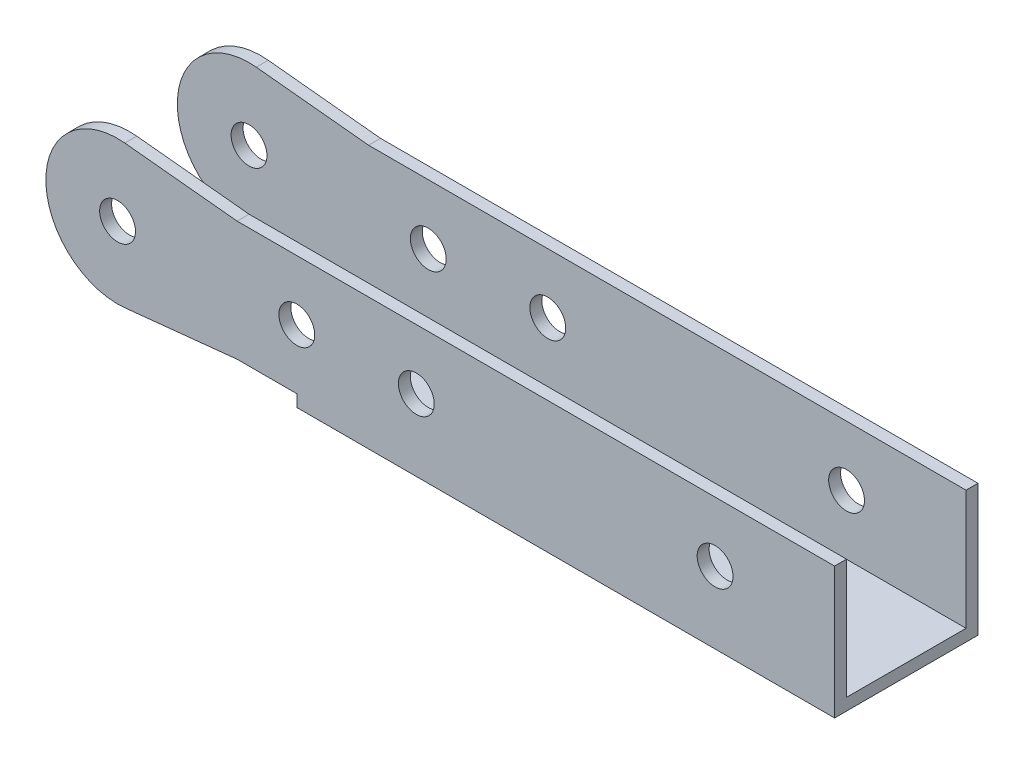
ISO-10303-21;
HEADER;
FILE_DESCRIPTION(('STEP AP214'),'2;1');
FILE_NAME('part.step','',(''),(''),'','','');
FILE_SCHEMA(('AUTOMOTIVE_DESIGN { 1 0 10303 214 1 1 1 1 }'));
ENDSEC;
DATA;
#1=APPLICATION_CONTEXT('core data for automotive mechanical design processes');
#2=APPLICATION_PROTOCOL_DEFINITION('international standard','automotive_design',2000,#1);
#3=PRODUCT_CONTEXT('',#1,'mechanical');
#4=PRODUCT('Part','Part','',(#3));
#5=PRODUCT_RELATED_PRODUCT_CATEGORY('part','',(#4));
#6=PRODUCT_DEFINITION_FORMATION('','',#4);
#7=PRODUCT_DEFINITION_CONTEXT('part definition',#1,'design');
#8=PRODUCT_DEFINITION('design','',#6,#7);
#9=PRODUCT_DEFINITION_SHAPE('','',#8);
#10=(LENGTH_UNIT() NAMED_UNIT(*) SI_UNIT(.MILLI.,.METRE.));
#11=(NAMED_UNIT(*) PLANE_ANGLE_UNIT() SI_UNIT($,.RADIAN.));
#12=(NAMED_UNIT(*) SI_UNIT($,.STERADIAN.) SOLID_ANGLE_UNIT());
#13=UNCERTAINTY_MEASURE_WITH_UNIT(LENGTH_MEASURE(1.E-05),#10,'distance_accuracy_value','');
#14=(GEOMETRIC_REPRESENTATION_CONTEXT(3) GLOBAL_UNCERTAINTY_ASSIGNED_CONTEXT((#13)) GLOBAL_UNIT_ASSIGNED_CONTEXT((#10,
#11,#12)) REPRESENTATION_CONTEXT('',''));
#15=CARTESIAN_POINT('',(0.,0.,0.));
#16=DIRECTION('',(0.,0.,1.));
#17=DIRECTION('',(1.,0.,0.));
#18=AXIS2_PLACEMENT_3D('',#15,#16,#17);
#19=CARTESIAN_POINT('',(-26.8000000000001,-2.,11.));
#20=DIRECTION('',(0.,1.,0.));
#21=DIRECTION('',(0.,0.,1.));
#22=AXIS2_PLACEMENT_3D('',#19,#20,#21);
#23=PLANE('',#22);
#24=DIRECTION('',(0.,0.,-1.));
#25=VECTOR('',#24,1.);
#26=CARTESIAN_POINT('',(-21.8000000000001,-2.,-1.00000000000001));
#27=LINE('',#26,#25);
#28=CARTESIAN_POINT('',(-21.8000000000001,-2.,11.));
#29=VERTEX_POINT('',#28);
#30=CARTESIAN_POINT('',(-21.8000000000001,-2.,10.));
#31=VERTEX_POINT('',#30);
#32=EDGE_CURVE('E152',#29,#31,#27,.T.);
#33=ORIENTED_EDGE('',*,*,#32,.F.);
#34=DIRECTION('',(1.,0.,0.));
#35=VECTOR('',#34,1.);
#36=CARTESIAN_POINT('',(-26.8000000000001,-2.,11.));
#37=LINE('',#36,#35);
#38=CARTESIAN_POINT('',(-26.8000000000001,-2.,11.));
#39=VERTEX_POINT('',#38);
#40=EDGE_CURVE('E120',#39,#29,#37,.T.);
#41=ORIENTED_EDGE('',*,*,#40,.F.);
#42=DIRECTION('',(0.,0.,-1.));
#43=VECTOR('',#42,1.);
#44=CARTESIAN_POINT('',(-26.8000000000001,-2.,11.));
#45=LINE('',#44,#43);
#46=CARTESIAN_POINT('',(-26.8000000000001,-2.,10.));
#47=VERTEX_POINT('',#46);
#48=EDGE_CURVE('E115',#39,#47,#45,.T.);
#49=ORIENTED_EDGE('',*,*,#48,.T.);
#50=DIRECTION('',(1.,0.,0.));
#51=VECTOR('',#50,1.);
#52=CARTESIAN_POINT('',(-26.8000000000001,-2.,10.));
#53=LINE('',#52,#51);
#54=EDGE_CURVE('E136',#47,#31,#53,.T.);
#55=ORIENTED_EDGE('',*,*,#54,.T.);
#56=EDGE_LOOP('',(#33,#41,#49,#55));
#57=FACE_BOUND('',#56,.T.);
#58=ADVANCED_FACE('F37',(#57),#23,.F.);
#59=CARTESIAN_POINT('',(-36.8000000000001,3.,11.));
#60=DIRECTION('',(0.,0.,1.));
#61=DIRECTION('',(1.,0.,0.));
#62=AXIS2_PLACEMENT_3D('',#59,#60,#61);
#63=PLANE('',#62);
#64=CARTESIAN_POINT('',(-21.8000000000001,3.,11.));
#65=DIRECTION('',(0.,0.,1.));
#66=DIRECTION('',(1.,0.,0.));
#67=AXIS2_PLACEMENT_3D('',#64,#65,#66);
#68=CIRCLE('',#67,1.5);
#69=CARTESIAN_POINT('',(-20.3000000000001,3.,11.));
#70=VERTEX_POINT('',#69);
#71=EDGE_CURVE('E300',#70,#70,#68,.T.);
#72=ORIENTED_EDGE('',*,*,#71,.F.);
#73=EDGE_LOOP('',(#72));
#74=FACE_BOUND('',#73,.T.);
#75=CARTESIAN_POINT('',(13.1999999999999,3.,11.));
#76=DIRECTION('',(0.,0.,1.));
#77=DIRECTION('',(1.,0.,0.));
#78=AXIS2_PLACEMENT_3D('',#75,#76,#77);
#79=CIRCLE('',#78,1.5);
#80=CARTESIAN_POINT('',(14.6999999999999,3.,11.));
#81=VERTEX_POINT('',#80);
#82=EDGE_CURVE('E131',#81,#81,#79,.T.);
#83=ORIENTED_EDGE('',*,*,#82,.F.);
#84=EDGE_LOOP('',(#83));
#85=FACE_BOUND('',#84,.T.);
#86=DIRECTION('',(-1.,0.,0.));
#87=VECTOR('',#86,1.);
#88=CARTESIAN_POINT('',(23.1999999999999,8.01039303833166,11.));
#89=LINE('',#88,#87);
#90=CARTESIAN_POINT('',(23.1999999999999,8.01039303833166,11.));
#91=VERTEX_POINT('',#90);
#92=CARTESIAN_POINT('',(-26.8000000000001,8.01039303833165,11.));
#93=VERTEX_POINT('',#92);
#94=EDGE_CURVE('E140',#91,#93,#89,.T.);
#95=ORIENTED_EDGE('',*,*,#94,.T.);
#96=DIRECTION('',(-0.994830345045225,0.101550896486432,0.));
#97=VECTOR('',#96,1.);
#98=CARTESIAN_POINT('',(-26.8000000000001,8.01039303833165,11.));
#99=LINE('',#98,#97);
#100=CARTESIAN_POINT('',(-36.1906946210815,8.96898207027135,11.));
#101=VERTEX_POINT('',#100);
#102=EDGE_CURVE('E91',#93,#101,#99,.T.);
#103=ORIENTED_EDGE('',*,*,#102,.T.);
#104=CARTESIAN_POINT('',(-36.8000000000001,3.,11.));
#105=DIRECTION('',(0.,0.,1.));
#106=DIRECTION('',(1.,0.,0.));
#107=AXIS2_PLACEMENT_3D('',#104,#105,#106);
#108=CIRCLE('',#107,6.);
#109=CARTESIAN_POINT('',(-36.1841554716937,-2.96831094338717,11.));
#110=VERTEX_POINT('',#109);
#111=EDGE_CURVE('E97',#101,#110,#108,.T.);
#112=ORIENTED_EDGE('',*,*,#111,.T.);
#113=DIRECTION('',(0.994718490564528,0.102640754717736,0.));
#114=VECTOR('',#113,1.);
#115=CARTESIAN_POINT('',(-36.1841554716937,-2.96831094338717,11.));
#116=LINE('',#115,#114);
#117=EDGE_CURVE('E103',#110,#39,#116,.T.);
#118=ORIENTED_EDGE('',*,*,#117,.T.);
#119=ORIENTED_EDGE('',*,*,#40,.T.);
#120=DIRECTION('',(0.,1.,0.));
#121=VECTOR('',#120,1.);
#122=CARTESIAN_POINT('',(-21.8000000000001,-3.,11.));
#123=LINE('',#122,#121);
#124=CARTESIAN_POINT('',(-21.8000000000001,-3.,11.));
#125=VERTEX_POINT('',#124);
#126=EDGE_CURVE('E156',#125,#29,#123,.T.);
#127=ORIENTED_EDGE('',*,*,#126,.F.);
#128=DIRECTION('',(-1.,0.,0.));
#129=VECTOR('',#128,1.);
#130=CARTESIAN_POINT('',(-21.8000000000001,-3.,11.));
#131=LINE('',#130,#129);
#132=CARTESIAN_POINT('',(23.1999999999999,-3.,11.));
#133=VERTEX_POINT('',#132);
#134=EDGE_CURVE('E274',#133,#125,#131,.T.);
#135=ORIENTED_EDGE('',*,*,#134,.F.);
#136=DIRECTION('',(0.,1.,0.));
#137=VECTOR('',#136,1.);
#138=CARTESIAN_POINT('',(23.1999999999999,-2.,11.));
#139=LINE('',#138,#137);
#140=EDGE_CURVE('E54',#133,#91,#139,.T.);
#141=ORIENTED_EDGE('',*,*,#140,.T.);
#142=EDGE_LOOP('',(#95,#103,#112,#118,#119,#127,#135,#141));
#143=FACE_BOUND('',#142,.T.);
#144=CARTESIAN_POINT('',(-11.8000000000001,3.,11.));
#145=DIRECTION('',(0.,0.,1.));
#146=DIRECTION('',(1.,0.,0.));
#147=AXIS2_PLACEMENT_3D('',#144,#145,#146);
#148=CIRCLE('',#147,1.5);
#149=CARTESIAN_POINT('',(-10.3000000000001,3.,11.));
#150=VERTEX_POINT('',#149);
#151=EDGE_CURVE('E306',#150,#150,#148,.T.);
#152=ORIENTED_EDGE('',*,*,#151,.F.);
#153=EDGE_LOOP('',(#152));
#154=FACE_BOUND('',#153,.T.);
#155=CARTESIAN_POINT('',(-36.8000000000001,3.,11.));
#156=DIRECTION('',(0.,0.,1.));
#157=DIRECTION('',(1.,0.,0.));
#158=AXIS2_PLACEMENT_3D('',#155,#156,#157);
#159=CIRCLE('',#158,1.5);
#160=CARTESIAN_POINT('',(-35.3000000000001,3.,11.));
#161=VERTEX_POINT('',#160);
#162=EDGE_CURVE('E294',#161,#161,#159,.T.);
#163=ORIENTED_EDGE('',*,*,#162,.F.);
#164=EDGE_LOOP('',(#163));
#165=FACE_BOUND('',#164,.T.);
#166=ADVANCED_FACE('F99',(#74,#85,#143,#154,#165),#63,.T.);
#167=CARTESIAN_POINT('',(-36.8000000000001,3.,10.));
#168=DIRECTION('',(0.,0.,1.));
#169=DIRECTION('',(1.,0.,0.));
#170=AXIS2_PLACEMENT_3D('',#167,#168,#169);
#171=PLANE('',#170);
#172=DIRECTION('',(-1.,0.,0.));
#173=VECTOR('',#172,1.);
#174=CARTESIAN_POINT('',(23.1999999999999,8.01039303833166,10.));
#175=LINE('',#174,#173);
#176=CARTESIAN_POINT('',(23.1999999999999,8.01039303833166,10.));
#177=VERTEX_POINT('',#176);
#178=CARTESIAN_POINT('',(-26.8000000000001,8.01039303833165,10.));
#179=VERTEX_POINT('',#178);
#180=EDGE_CURVE('E127',#177,#179,#175,.T.);
#181=ORIENTED_EDGE('',*,*,#180,.F.);
#182=DIRECTION('',(0.,1.,0.));
#183=VECTOR('',#182,1.);
#184=CARTESIAN_POINT('',(23.1999999999999,-2.,10.));
#185=LINE('',#184,#183);
#186=CARTESIAN_POINT('',(23.1999999999999,-2.,10.));
#187=VERTEX_POINT('',#186);
#188=EDGE_CURVE('E83',#187,#177,#185,.T.);
#189=ORIENTED_EDGE('',*,*,#188,.F.);
#190=DIRECTION('',(-1.,0.,0.));
#191=VECTOR('',#190,1.);
#192=CARTESIAN_POINT('',(-36.8000000000001,-2.,10.));
#193=LINE('',#192,#191);
#194=EDGE_CURVE('E291',#187,#31,#193,.T.);
#195=ORIENTED_EDGE('',*,*,#194,.T.);
#196=ORIENTED_EDGE('',*,*,#54,.F.);
#197=DIRECTION('',(0.994718490564528,0.102640754717736,0.));
#198=VECTOR('',#197,1.);
#199=CARTESIAN_POINT('',(-36.1841554716937,-2.96831094338717,10.));
#200=LINE('',#199,#198);
#201=CARTESIAN_POINT('',(-36.1841554716937,-2.96831094338717,10.));
#202=VERTEX_POINT('',#201);
#203=EDGE_CURVE('E134',#202,#47,#200,.T.);
#204=ORIENTED_EDGE('',*,*,#203,.F.);
#205=CARTESIAN_POINT('',(-36.8000000000001,3.,10.));
#206=DIRECTION('',(0.,0.,1.));
#207=DIRECTION('',(1.,0.,0.));
#208=AXIS2_PLACEMENT_3D('',#205,#206,#207);
#209=CIRCLE('',#208,6.);
#210=CARTESIAN_POINT('',(-36.1906946210815,8.96898207027135,10.));
#211=VERTEX_POINT('',#210);
#212=EDGE_CURVE('E112',#211,#202,#209,.T.);
#213=ORIENTED_EDGE('',*,*,#212,.F.);
#214=DIRECTION('',(-0.994830345045225,0.101550896486432,0.));
#215=VECTOR('',#214,1.);
#216=CARTESIAN_POINT('',(-26.8000000000001,8.01039303833165,10.));
#217=LINE('',#216,#215);
#218=EDGE_CURVE('E130',#179,#211,#217,.T.);
#219=ORIENTED_EDGE('',*,*,#218,.F.);
#220=EDGE_LOOP('',(#181,#189,#195,#196,#204,#213,#219));
#221=FACE_BOUND('',#220,.T.);
#222=CARTESIAN_POINT('',(13.1999999999999,3.,10.));
#223=DIRECTION('',(0.,0.,1.));
#224=DIRECTION('',(1.,0.,0.));
#225=AXIS2_PLACEMENT_3D('',#222,#223,#224);
#226=CIRCLE('',#225,1.5);
#227=CARTESIAN_POINT('',(14.6999999999999,3.,10.));
#228=VERTEX_POINT('',#227);
#229=EDGE_CURVE('E309',#228,#228,#226,.T.);
#230=ORIENTED_EDGE('',*,*,#229,.T.);
#231=EDGE_LOOP('',(#230));
#232=FACE_BOUND('',#231,.T.);
#233=CARTESIAN_POINT('',(-11.8000000000001,3.,10.));
#234=DIRECTION('',(0.,0.,1.));
#235=DIRECTION('',(1.,0.,0.));
#236=AXIS2_PLACEMENT_3D('',#233,#234,#235);
#237=CIRCLE('',#236,1.5);
#238=CARTESIAN_POINT('',(-10.3000000000001,3.,10.));
#239=VERTEX_POINT('',#238);
#240=EDGE_CURVE('E303',#239,#239,#237,.T.);
#241=ORIENTED_EDGE('',*,*,#240,.T.);
#242=EDGE_LOOP('',(#241));
#243=FACE_BOUND('',#242,.T.);
#244=CARTESIAN_POINT('',(-21.8000000000001,3.,10.));
#245=DIRECTION('',(0.,0.,1.));
#246=DIRECTION('',(1.,0.,0.));
#247=AXIS2_PLACEMENT_3D('',#244,#245,#246);
#248=CIRCLE('',#247,1.5);
#249=CARTESIAN_POINT('',(-20.3000000000001,3.,10.));
#250=VERTEX_POINT('',#249);
#251=EDGE_CURVE('E297',#250,#250,#248,.T.);
#252=ORIENTED_EDGE('',*,*,#251,.T.);
#253=EDGE_LOOP('',(#252));
#254=FACE_BOUND('',#253,.T.);
#255=CARTESIAN_POINT('',(-36.8000000000001,3.,10.));
#256=DIRECTION('',(0.,0.,1.));
#257=DIRECTION('',(1.,0.,0.));
#258=AXIS2_PLACEMENT_3D('',#255,#256,#257);
#259=CIRCLE('',#258,1.5);
#260=CARTESIAN_POINT('',(-35.3000000000001,3.,10.));
#261=VERTEX_POINT('',#260);
#262=EDGE_CURVE('E293',#261,#261,#259,.T.);
#263=ORIENTED_EDGE('',*,*,#262,.T.);
#264=EDGE_LOOP('',(#263));
#265=FACE_BOUND('',#264,.T.);
#266=ADVANCED_FACE('F144',(#221,#232,#243,#254,#265),#171,.F.);
#267=CARTESIAN_POINT('',(23.1999999999999,8.01039303833166,11.));
#268=DIRECTION('',(0.,-1.,0.));
#269=DIRECTION('',(1.,0.,0.));
#270=AXIS2_PLACEMENT_3D('',#267,#268,#269);
#271=PLANE('',#270);
#272=ORIENTED_EDGE('',*,*,#180,.T.);
#273=DIRECTION('',(0.,0.,-1.));
#274=VECTOR('',#273,1.);
#275=CARTESIAN_POINT('',(-26.8000000000001,8.01039303833165,11.));
#276=LINE('',#275,#274);
#277=EDGE_CURVE('E11',#93,#179,#276,.T.);
#278=ORIENTED_EDGE('',*,*,#277,.F.);
#279=ORIENTED_EDGE('',*,*,#94,.F.);
#280=DIRECTION('',(0.,0.,-1.));
#281=VECTOR('',#280,1.);
#282=CARTESIAN_POINT('',(23.1999999999999,8.01039303833166,11.));
#283=LINE('',#282,#281);
#284=EDGE_CURVE('E126',#91,#177,#283,.T.);
#285=ORIENTED_EDGE('',*,*,#284,.T.);
#286=EDGE_LOOP('',(#272,#278,#279,#285));
#287=FACE_BOUND('',#286,.T.);
#288=ADVANCED_FACE('F39',(#287),#271,.F.);
#289=CARTESIAN_POINT('',(-26.8000000000001,8.01039303833165,11.));
#290=DIRECTION('',(-0.101550896486432,-0.994830345045225,0.));
#291=DIRECTION('',(0.994830345045225,-0.101550896486432,0.));
#292=AXIS2_PLACEMENT_3D('',#289,#290,#291);
#293=PLANE('',#292);
#294=ORIENTED_EDGE('',*,*,#218,.T.);
#295=DIRECTION('',(0.,0.,-1.));
#296=VECTOR('',#295,1.);
#297=CARTESIAN_POINT('',(-36.1906946210815,8.96898207027135,11.));
#298=LINE('',#297,#296);
#299=EDGE_CURVE('E46',#101,#211,#298,.T.);
#300=ORIENTED_EDGE('',*,*,#299,.F.);
#301=ORIENTED_EDGE('',*,*,#102,.F.);
#302=ORIENTED_EDGE('',*,*,#277,.T.);
#303=EDGE_LOOP('',(#294,#300,#301,#302));
#304=FACE_BOUND('',#303,.T.);
#305=ADVANCED_FACE('F319',(#304),#293,.F.);
#306=CARTESIAN_POINT('',(-36.8000000000001,3.,11.));
#307=DIRECTION('',(0.,0.,-1.));
#308=DIRECTION('',(-1.,0.,0.));
#309=AXIS2_PLACEMENT_3D('',#306,#307,#308);
#310=CYLINDRICAL_SURFACE('',#309,6.);
#311=ORIENTED_EDGE('',*,*,#212,.T.);
#312=DIRECTION('',(0.,0.,-1.));
#313=VECTOR('',#312,1.);
#314=CARTESIAN_POINT('',(-36.1841554716937,-2.96831094338717,11.));
#315=LINE('',#314,#313);
#316=EDGE_CURVE('E109',#110,#202,#315,.T.);
#317=ORIENTED_EDGE('',*,*,#316,.F.);
#318=ORIENTED_EDGE('',*,*,#111,.F.);
#319=ORIENTED_EDGE('',*,*,#299,.T.);
#320=EDGE_LOOP('',(#311,#317,#318,#319));
#321=FACE_BOUND('',#320,.T.);
#322=ADVANCED_FACE('F110',(#321),#310,.T.);
#323=CARTESIAN_POINT('',(-36.1841554716937,-2.96831094338717,11.));
#324=DIRECTION('',(-0.102640754717736,0.994718490564528,0.));
#325=DIRECTION('',(-0.994718490564528,-0.102640754717736,0.));
#326=AXIS2_PLACEMENT_3D('',#323,#324,#325);
#327=PLANE('',#326);
#328=ORIENTED_EDGE('',*,*,#203,.T.);
#329=ORIENTED_EDGE('',*,*,#48,.F.);
#330=ORIENTED_EDGE('',*,*,#117,.F.);
#331=ORIENTED_EDGE('',*,*,#316,.T.);
#332=EDGE_LOOP('',(#328,#329,#330,#331));
#333=FACE_BOUND('',#332,.T.);
#334=ADVANCED_FACE('F117',(#333),#327,.F.);
#335=CARTESIAN_POINT('',(23.1999999999999,-2.,11.));
#336=DIRECTION('',(-1.,0.,0.));
#337=DIRECTION('',(0.,-1.,0.));
#338=AXIS2_PLACEMENT_3D('',#335,#336,#337);
#339=PLANE('',#338);
#340=ORIENTED_EDGE('',*,*,#188,.T.);
#341=ORIENTED_EDGE('',*,*,#284,.F.);
#342=ORIENTED_EDGE('',*,*,#140,.F.);
#343=DIRECTION('',(0.,0.,1.));
#344=VECTOR('',#343,1.);
#345=CARTESIAN_POINT('',(23.1999999999999,-3.,11.));
#346=LINE('',#345,#344);
#347=CARTESIAN_POINT('',(23.1999999999999,-3.,-1.));
#348=VERTEX_POINT('',#347);
#349=EDGE_CURVE('E281',#348,#133,#346,.T.);
#350=ORIENTED_EDGE('',*,*,#349,.F.);
#351=DIRECTION('',(0.,1.,0.));
#352=VECTOR('',#351,1.);
#353=CARTESIAN_POINT('',(23.1999999999999,-3.,-1.));
#354=LINE('',#353,#352);
#355=CARTESIAN_POINT('',(23.1999999999999,8.01039303833166,-1.));
#356=VERTEX_POINT('',#355);
#357=EDGE_CURVE('E284',#348,#356,#354,.T.);
#358=ORIENTED_EDGE('',*,*,#357,.T.);
#359=DIRECTION('',(0.,0.,1.));
#360=VECTOR('',#359,1.);
#361=CARTESIAN_POINT('',(23.1999999999999,8.01039303833166,-1.));
#362=LINE('',#361,#360);
#363=CARTESIAN_POINT('',(23.1999999999999,8.01039303833166,0.));
#364=VERTEX_POINT('',#363);
#365=EDGE_CURVE('E266',#356,#364,#362,.T.);
#366=ORIENTED_EDGE('',*,*,#365,.T.);
#367=DIRECTION('',(0.,1.,0.));
#368=VECTOR('',#367,1.);
#369=CARTESIAN_POINT('',(23.1999999999999,8.01039303833166,0.));
#370=LINE('',#369,#368);
#371=CARTESIAN_POINT('',(23.1999999999999,-2.,0.));
#372=VERTEX_POINT('',#371);
#373=EDGE_CURVE('E241',#372,#364,#370,.T.);
#374=ORIENTED_EDGE('',*,*,#373,.F.);
#375=DIRECTION('',(0.,0.,1.));
#376=VECTOR('',#375,1.);
#377=CARTESIAN_POINT('',(23.1999999999999,-2.,11.));
#378=LINE('',#377,#376);
#379=EDGE_CURVE('E79',#372,#187,#378,.T.);
#380=ORIENTED_EDGE('',*,*,#379,.T.);
#381=EDGE_LOOP('',(#340,#341,#342,#350,#358,#366,#374,#380));
#382=FACE_BOUND('',#381,.T.);
#383=ADVANCED_FACE('F335',(#382),#339,.F.);
#384=CARTESIAN_POINT('',(13.1999999999999,3.,11.));
#385=DIRECTION('',(0.,0.,-1.));
#386=DIRECTION('',(-1.,0.,0.));
#387=AXIS2_PLACEMENT_3D('',#384,#385,#386);
#388=CYLINDRICAL_SURFACE('',#387,1.5);
#389=ORIENTED_EDGE('',*,*,#82,.T.);
#390=EDGE_LOOP('',(#389));
#391=FACE_BOUND('',#390,.T.);
#392=ORIENTED_EDGE('',*,*,#229,.F.);
#393=EDGE_LOOP('',(#392));
#394=FACE_BOUND('',#393,.T.);
#395=ADVANCED_FACE('F341',(#391,#394),#388,.F.);
#396=CARTESIAN_POINT('',(-11.8000000000001,3.,11.));
#397=DIRECTION('',(0.,0.,-1.));
#398=DIRECTION('',(-1.,0.,0.));
#399=AXIS2_PLACEMENT_3D('',#396,#397,#398);
#400=CYLINDRICAL_SURFACE('',#399,1.5);
#401=ORIENTED_EDGE('',*,*,#151,.T.);
#402=EDGE_LOOP('',(#401));
#403=FACE_BOUND('',#402,.T.);
#404=ORIENTED_EDGE('',*,*,#240,.F.);
#405=EDGE_LOOP('',(#404));
#406=FACE_BOUND('',#405,.T.);
#407=ADVANCED_FACE('F345',(#403,#406),#400,.F.);
#408=CARTESIAN_POINT('',(-21.8000000000001,3.,11.));
#409=DIRECTION('',(0.,0.,-1.));
#410=DIRECTION('',(-1.,0.,0.));
#411=AXIS2_PLACEMENT_3D('',#408,#409,#410);
#412=CYLINDRICAL_SURFACE('',#411,1.5);
#413=ORIENTED_EDGE('',*,*,#71,.T.);
#414=EDGE_LOOP('',(#413));
#415=FACE_BOUND('',#414,.T.);
#416=ORIENTED_EDGE('',*,*,#251,.F.);
#417=EDGE_LOOP('',(#416));
#418=FACE_BOUND('',#417,.T.);
#419=ADVANCED_FACE('F351',(#415,#418),#412,.F.);
#420=CARTESIAN_POINT('',(-36.8000000000001,3.,11.));
#421=DIRECTION('',(0.,0.,-1.));
#422=DIRECTION('',(-1.,0.,0.));
#423=AXIS2_PLACEMENT_3D('',#420,#421,#422);
#424=CYLINDRICAL_SURFACE('',#423,1.5);
#425=ORIENTED_EDGE('',*,*,#162,.T.);
#426=EDGE_LOOP('',(#425));
#427=FACE_BOUND('',#426,.T.);
#428=ORIENTED_EDGE('',*,*,#262,.F.);
#429=EDGE_LOOP('',(#428));
#430=FACE_BOUND('',#429,.T.);
#431=ADVANCED_FACE('F399',(#427,#430),#424,.F.);
#432=CARTESIAN_POINT('',(0.,-2.,0.));
#433=DIRECTION('',(0.,1.,0.));
#434=DIRECTION('',(0.,0.,1.));
#435=AXIS2_PLACEMENT_3D('',#432,#433,#434);
#436=PLANE('',#435);
#437=DIRECTION('',(1.,0.,0.));
#438=VECTOR('',#437,1.);
#439=CARTESIAN_POINT('',(-26.8000000000001,-2.,0.));
#440=LINE('',#439,#438);
#441=CARTESIAN_POINT('',(-21.8000000000001,-2.,0.));
#442=VERTEX_POINT('',#441);
#443=EDGE_CURVE('E258',#442,#372,#440,.T.);
#444=ORIENTED_EDGE('',*,*,#443,.F.);
#445=EDGE_CURVE('E273',#31,#442,#27,.T.);
#446=ORIENTED_EDGE('',*,*,#445,.F.);
#447=ORIENTED_EDGE('',*,*,#194,.F.);
#448=ORIENTED_EDGE('',*,*,#379,.F.);
#449=EDGE_LOOP('',(#444,#446,#447,#448));
#450=FACE_BOUND('',#449,.T.);
#451=ADVANCED_FACE('F407',(#450),#436,.T.);
#452=CARTESIAN_POINT('',(-21.8000000000001,-3.,-1.00000000000001));
#453=DIRECTION('',(1.,0.,0.));
#454=DIRECTION('',(0.,0.,-1.));
#455=AXIS2_PLACEMENT_3D('',#452,#453,#454);
#456=PLANE('',#455);
#457=ORIENTED_EDGE('',*,*,#32,.T.);
#458=ORIENTED_EDGE('',*,*,#445,.T.);
#459=DIRECTION('',(0.,0.,-1.));
#460=VECTOR('',#459,1.);
#461=CARTESIAN_POINT('',(-21.8000000000001,-2.,-1.00000000000001));
#462=LINE('',#461,#460);
#463=CARTESIAN_POINT('',(-21.8000000000001,-2.,-1.));
#464=VERTEX_POINT('',#463);
#465=EDGE_CURVE('E265',#442,#464,#462,.T.);
#466=ORIENTED_EDGE('',*,*,#465,.T.);
#467=DIRECTION('',(0.,1.,0.));
#468=VECTOR('',#467,1.);
#469=CARTESIAN_POINT('',(-21.8000000000001,-3.,-1.00000000000001));
#470=LINE('',#469,#468);
#471=CARTESIAN_POINT('',(-21.8000000000001,-3.,-1.00000000000001));
#472=VERTEX_POINT('',#471);
#473=EDGE_CURVE('E288',#472,#464,#470,.T.);
#474=ORIENTED_EDGE('',*,*,#473,.F.);
#475=DIRECTION('',(0.,0.,-1.));
#476=VECTOR('',#475,1.);
#477=CARTESIAN_POINT('',(-21.8000000000001,-3.,-1.00000000000001));
#478=LINE('',#477,#476);
#479=EDGE_CURVE('E277',#125,#472,#478,.T.);
#480=ORIENTED_EDGE('',*,*,#479,.F.);
#481=ORIENTED_EDGE('',*,*,#126,.T.);
#482=EDGE_LOOP('',(#457,#458,#466,#474,#480,#481));
#483=FACE_BOUND('',#482,.T.);
#484=ADVANCED_FACE('F439',(#483),#456,.F.);
#485=CARTESIAN_POINT('',(23.1999999999999,-3.,-1.));
#486=DIRECTION('',(0.,0.,1.));
#487=DIRECTION('',(1.,0.,0.));
#488=AXIS2_PLACEMENT_3D('',#485,#486,#487);
#489=PLANE('',#488);
#490=ORIENTED_EDGE('',*,*,#473,.T.);
#491=DIRECTION('',(1.,0.,0.));
#492=VECTOR('',#491,1.);
#493=CARTESIAN_POINT('',(-26.8000000000001,-2.,-1.));
#494=LINE('',#493,#492);
#495=CARTESIAN_POINT('',(-26.8000000000001,-2.,-1.));
#496=VERTEX_POINT('',#495);
#497=EDGE_CURVE('E248',#496,#464,#494,.T.);
#498=ORIENTED_EDGE('',*,*,#497,.F.);
#499=DIRECTION('',(0.994718490564528,0.102640754717736,0.));
#500=VECTOR('',#499,1.);
#501=CARTESIAN_POINT('',(-26.8000000000001,-2.,-1.));
#502=LINE('',#501,#500);
#503=CARTESIAN_POINT('',(-36.1841554716937,-2.96831094338717,-1.));
#504=VERTEX_POINT('',#503);
#505=EDGE_CURVE('E234',#504,#496,#502,.T.);
#506=ORIENTED_EDGE('',*,*,#505,.F.);
#507=CARTESIAN_POINT('',(-36.8000000000001,3.,-1.));
#508=DIRECTION('',(0.,0.,1.));
#509=DIRECTION('',(1.,0.,0.));
#510=AXIS2_PLACEMENT_3D('',#507,#508,#509);
#511=CIRCLE('',#510,6.);
#512=CARTESIAN_POINT('',(-36.1906946210815,8.96898207027135,-1.));
#513=VERTEX_POINT('',#512);
#514=EDGE_CURVE('E213',#513,#504,#511,.T.);
#515=ORIENTED_EDGE('',*,*,#514,.F.);
#516=DIRECTION('',(-0.994830345045225,0.101550896486433,0.));
#517=VECTOR('',#516,1.);
#518=CARTESIAN_POINT('',(-26.8000000000001,8.01039303833165,-1.));
#519=LINE('',#518,#517);
#520=CARTESIAN_POINT('',(-26.8000000000001,8.01039303833165,-1.));
#521=VERTEX_POINT('',#520);
#522=EDGE_CURVE('E230',#521,#513,#519,.T.);
#523=ORIENTED_EDGE('',*,*,#522,.F.);
#524=DIRECTION('',(-1.,0.,0.));
#525=VECTOR('',#524,1.);
#526=CARTESIAN_POINT('',(23.1999999999999,8.01039303833166,-1.));
#527=LINE('',#526,#525);
#528=EDGE_CURVE('E221',#356,#521,#527,.T.);
#529=ORIENTED_EDGE('',*,*,#528,.F.);
#530=ORIENTED_EDGE('',*,*,#357,.F.);
#531=DIRECTION('',(1.,0.,0.));
#532=VECTOR('',#531,1.);
#533=CARTESIAN_POINT('',(23.1999999999999,-3.,-1.));
#534=LINE('',#533,#532);
#535=EDGE_CURVE('E279',#472,#348,#534,.T.);
#536=ORIENTED_EDGE('',*,*,#535,.F.);
#537=EDGE_LOOP('',(#490,#498,#506,#515,#523,#529,#530,#536));
#538=FACE_BOUND('',#537,.T.);
#539=CARTESIAN_POINT('',(13.1999999999999,3.,-1.));
#540=DIRECTION('',(0.,0.,1.));
#541=DIRECTION('',(1.,0.,0.));
#542=AXIS2_PLACEMENT_3D('',#539,#540,#541);
#543=CIRCLE('',#542,1.5);
#544=CARTESIAN_POINT('',(14.6999999999999,3.,-1.));
#545=VERTEX_POINT('',#544);
#546=EDGE_CURVE('E566',#545,#545,#543,.T.);
#547=ORIENTED_EDGE('',*,*,#546,.T.);
#548=EDGE_LOOP('',(#547));
#549=FACE_BOUND('',#548,.T.);
#550=CARTESIAN_POINT('',(-11.8000000000001,3.,-1.));
#551=DIRECTION('',(0.,0.,1.));
#552=DIRECTION('',(1.,0.,0.));
#553=AXIS2_PLACEMENT_3D('',#550,#551,#552);
#554=CIRCLE('',#553,1.5);
#555=CARTESIAN_POINT('',(-10.3000000000001,3.,-1.));
#556=VERTEX_POINT('',#555);
#557=EDGE_CURVE('E574',#556,#556,#554,.T.);
#558=ORIENTED_EDGE('',*,*,#557,.T.);
#559=EDGE_LOOP('',(#558));
#560=FACE_BOUND('',#559,.T.);
#561=CARTESIAN_POINT('',(-21.8000000000001,3.,-1.));
#562=DIRECTION('',(0.,0.,1.));
#563=DIRECTION('',(1.,0.,0.));
#564=AXIS2_PLACEMENT_3D('',#561,#562,#563);
#565=CIRCLE('',#564,1.5);
#566=CARTESIAN_POINT('',(-20.3000000000001,3.,-1.));
#567=VERTEX_POINT('',#566);
#568=EDGE_CURVE('E580',#567,#567,#565,.T.);
#569=ORIENTED_EDGE('',*,*,#568,.T.);
#570=EDGE_LOOP('',(#569));
#571=FACE_BOUND('',#570,.T.);
#572=CARTESIAN_POINT('',(-36.8000000000001,3.,-1.));
#573=DIRECTION('',(0.,0.,1.));
#574=DIRECTION('',(1.,0.,0.));
#575=AXIS2_PLACEMENT_3D('',#572,#573,#574);
#576=CIRCLE('',#575,1.5);
#577=CARTESIAN_POINT('',(-35.3000000000001,3.,-1.));
#578=VERTEX_POINT('',#577);
#579=EDGE_CURVE('E253',#578,#578,#576,.T.);
#580=ORIENTED_EDGE('',*,*,#579,.T.);
#581=EDGE_LOOP('',(#580));
#582=FACE_BOUND('',#581,.T.);
#583=ADVANCED_FACE('F227',(#538,#549,#560,#571,#582),#489,.F.);
#584=CARTESIAN_POINT('',(0.,-3.,0.));
#585=DIRECTION('',(0.,1.,0.));
#586=DIRECTION('',(0.,0.,1.));
#587=AXIS2_PLACEMENT_3D('',#584,#585,#586);
#588=PLANE('',#587);
#589=ORIENTED_EDGE('',*,*,#134,.T.);
#590=ORIENTED_EDGE('',*,*,#479,.T.);
#591=ORIENTED_EDGE('',*,*,#535,.T.);
#592=ORIENTED_EDGE('',*,*,#349,.T.);
#593=EDGE_LOOP('',(#589,#590,#591,#592));
#594=FACE_BOUND('',#593,.T.);
#595=ADVANCED_FACE('F455',(#594),#588,.F.);
#596=CARTESIAN_POINT('',(-26.8000000000001,-2.,-1.));
#597=DIRECTION('',(0.,-1.,0.));
#598=DIRECTION('',(0.,0.,-1.));
#599=AXIS2_PLACEMENT_3D('',#596,#597,#598);
#600=PLANE('',#599);
#601=ORIENTED_EDGE('',*,*,#465,.F.);
#602=CARTESIAN_POINT('',(-26.8000000000001,-2.,0.));
#603=VERTEX_POINT('',#602);
#604=EDGE_CURVE('E259',#603,#442,#440,.T.);
#605=ORIENTED_EDGE('',*,*,#604,.F.);
#606=DIRECTION('',(0.,0.,1.));
#607=VECTOR('',#606,1.);
#608=CARTESIAN_POINT('',(-26.8000000000001,-2.,-1.));
#609=LINE('',#608,#607);
#610=EDGE_CURVE('E268',#496,#603,#609,.T.);
#611=ORIENTED_EDGE('',*,*,#610,.F.);
#612=ORIENTED_EDGE('',*,*,#497,.T.);
#613=EDGE_LOOP('',(#601,#605,#611,#612));
#614=FACE_BOUND('',#613,.T.);
#615=ADVANCED_FACE('F465',(#614),#600,.T.);
#616=CARTESIAN_POINT('',(-26.8000000000001,8.01039303833165,-1.));
#617=DIRECTION('',(0.101550896486433,0.994830345045225,0.));
#618=DIRECTION('',(-0.994830345045225,0.101550896486433,0.));
#619=AXIS2_PLACEMENT_3D('',#616,#617,#618);
#620=PLANE('',#619);
#621=DIRECTION('',(-0.994830345045225,0.101550896486433,0.));
#622=VECTOR('',#621,1.);
#623=CARTESIAN_POINT('',(-26.8000000000001,8.01039303833165,0.));
#624=LINE('',#623,#622);
#625=CARTESIAN_POINT('',(-26.8000000000001,8.01039303833165,0.));
#626=VERTEX_POINT('',#625);
#627=CARTESIAN_POINT('',(-36.1906946210815,8.96898207027135,0.));
#628=VERTEX_POINT('',#627);
#629=EDGE_CURVE('E251',#626,#628,#624,.T.);
#630=ORIENTED_EDGE('',*,*,#629,.F.);
#631=DIRECTION('',(0.,0.,1.));
#632=VECTOR('',#631,1.);
#633=CARTESIAN_POINT('',(-26.8000000000001,8.01039303833165,-1.));
#634=LINE('',#633,#632);
#635=EDGE_CURVE('E237',#521,#626,#634,.T.);
#636=ORIENTED_EDGE('',*,*,#635,.F.);
#637=ORIENTED_EDGE('',*,*,#522,.T.);
#638=DIRECTION('',(0.,0.,1.));
#639=VECTOR('',#638,1.);
#640=CARTESIAN_POINT('',(-36.1906946210815,8.96898207027135,-1.));
#641=LINE('',#640,#639);
#642=EDGE_CURVE('E210',#513,#628,#641,.T.);
#643=ORIENTED_EDGE('',*,*,#642,.T.);
#644=EDGE_LOOP('',(#630,#636,#637,#643));
#645=FACE_BOUND('',#644,.T.);
#646=ADVANCED_FACE('F236',(#645),#620,.T.);
#647=CARTESIAN_POINT('',(23.1999999999999,8.01039303833166,-1.));
#648=DIRECTION('',(0.,1.,0.));
#649=DIRECTION('',(-1.,0.,0.));
#650=AXIS2_PLACEMENT_3D('',#647,#648,#649);
#651=PLANE('',#650);
#652=DIRECTION('',(-1.,0.,0.));
#653=VECTOR('',#652,1.);
#654=CARTESIAN_POINT('',(23.1999999999999,8.01039303833166,0.));
#655=LINE('',#654,#653);
#656=EDGE_CURVE('E238',#364,#626,#655,.T.);
#657=ORIENTED_EDGE('',*,*,#656,.F.);
#658=ORIENTED_EDGE('',*,*,#365,.F.);
#659=ORIENTED_EDGE('',*,*,#528,.T.);
#660=ORIENTED_EDGE('',*,*,#635,.T.);
#661=EDGE_LOOP('',(#657,#658,#659,#660));
#662=FACE_BOUND('',#661,.T.);
#663=ADVANCED_FACE('F483',(#662),#651,.T.);
#664=CARTESIAN_POINT('',(-26.8000000000001,-2.,-1.));
#665=DIRECTION('',(0.102640754717736,-0.994718490564528,0.));
#666=DIRECTION('',(0.994718490564528,0.102640754717736,0.));
#667=AXIS2_PLACEMENT_3D('',#664,#665,#666);
#668=PLANE('',#667);
#669=DIRECTION('',(0.994718490564528,0.102640754717736,0.));
#670=VECTOR('',#669,1.);
#671=CARTESIAN_POINT('',(-26.8000000000001,-2.,0.));
#672=LINE('',#671,#670);
#673=CARTESIAN_POINT('',(-36.1841554716937,-2.96831094338717,0.));
#674=VERTEX_POINT('',#673);
#675=EDGE_CURVE('E255',#674,#603,#672,.T.);
#676=ORIENTED_EDGE('',*,*,#675,.F.);
#677=DIRECTION('',(0.,0.,1.));
#678=VECTOR('',#677,1.);
#679=CARTESIAN_POINT('',(-36.1841554716937,-2.96831094338717,-1.));
#680=LINE('',#679,#678);
#681=EDGE_CURVE('E220',#504,#674,#680,.T.);
#682=ORIENTED_EDGE('',*,*,#681,.F.);
#683=ORIENTED_EDGE('',*,*,#505,.T.);
#684=ORIENTED_EDGE('',*,*,#610,.T.);
#685=EDGE_LOOP('',(#676,#682,#683,#684));
#686=FACE_BOUND('',#685,.T.);
#687=ADVANCED_FACE('F492',(#686),#668,.T.);
#688=CARTESIAN_POINT('',(-36.8000000000001,3.,-1.));
#689=DIRECTION('',(0.,0.,1.));
#690=DIRECTION('',(1.,0.,0.));
#691=AXIS2_PLACEMENT_3D('',#688,#689,#690);
#692=CYLINDRICAL_SURFACE('',#691,6.);
#693=CARTESIAN_POINT('',(-36.8000000000001,3.,0.));
#694=DIRECTION('',(0.,0.,1.));
#695=DIRECTION('',(1.,0.,0.));
#696=AXIS2_PLACEMENT_3D('',#693,#694,#695);
#697=CIRCLE('',#696,6.);
#698=EDGE_CURVE('E215',#628,#674,#697,.T.);
#699=ORIENTED_EDGE('',*,*,#698,.F.);
#700=ORIENTED_EDGE('',*,*,#642,.F.);
#701=ORIENTED_EDGE('',*,*,#514,.T.);
#702=ORIENTED_EDGE('',*,*,#681,.T.);
#703=EDGE_LOOP('',(#699,#700,#701,#702));
#704=FACE_BOUND('',#703,.T.);
#705=ADVANCED_FACE('F212',(#704),#692,.T.);
#706=CARTESIAN_POINT('',(-36.8000000000001,3.,0.));
#707=DIRECTION('',(0.,0.,1.));
#708=DIRECTION('',(1.,0.,0.));
#709=AXIS2_PLACEMENT_3D('',#706,#707,#708);
#710=PLANE('',#709);
#711=CARTESIAN_POINT('',(13.1999999999999,3.,0.));
#712=DIRECTION('',(0.,0.,1.));
#713=DIRECTION('',(1.,0.,0.));
#714=AXIS2_PLACEMENT_3D('',#711,#712,#713);
#715=CIRCLE('',#714,1.5);
#716=CARTESIAN_POINT('',(14.6999999999999,3.,0.));
#717=VERTEX_POINT('',#716);
#718=EDGE_CURVE('E569',#717,#717,#715,.T.);
#719=ORIENTED_EDGE('',*,*,#718,.F.);
#720=EDGE_LOOP('',(#719));
#721=FACE_BOUND('',#720,.T.);
#722=CARTESIAN_POINT('',(-11.8000000000001,3.,0.));
#723=DIRECTION('',(0.,0.,1.));
#724=DIRECTION('',(1.,0.,0.));
#725=AXIS2_PLACEMENT_3D('',#722,#723,#724);
#726=CIRCLE('',#725,1.5);
#727=CARTESIAN_POINT('',(-10.3000000000001,3.,0.));
#728=VERTEX_POINT('',#727);
#729=EDGE_CURVE('E571',#728,#728,#726,.T.);
#730=ORIENTED_EDGE('',*,*,#729,.F.);
#731=EDGE_LOOP('',(#730));
#732=FACE_BOUND('',#731,.T.);
#733=CARTESIAN_POINT('',(-21.8000000000001,3.,0.));
#734=DIRECTION('',(0.,0.,1.));
#735=DIRECTION('',(1.,0.,0.));
#736=AXIS2_PLACEMENT_3D('',#733,#734,#735);
#737=CIRCLE('',#736,1.5);
#738=CARTESIAN_POINT('',(-20.3000000000001,3.,0.));
#739=VERTEX_POINT('',#738);
#740=EDGE_CURVE('E577',#739,#739,#737,.T.);
#741=ORIENTED_EDGE('',*,*,#740,.F.);
#742=EDGE_LOOP('',(#741));
#743=FACE_BOUND('',#742,.T.);
#744=CARTESIAN_POINT('',(-36.8000000000001,3.,0.));
#745=DIRECTION('',(0.,0.,1.));
#746=DIRECTION('',(1.,0.,0.));
#747=AXIS2_PLACEMENT_3D('',#744,#745,#746);
#748=CIRCLE('',#747,1.5);
#749=CARTESIAN_POINT('',(-35.3000000000001,3.,0.));
#750=VERTEX_POINT('',#749);
#751=EDGE_CURVE('E244',#750,#750,#748,.T.);
#752=ORIENTED_EDGE('',*,*,#751,.F.);
#753=EDGE_LOOP('',(#752));
#754=FACE_BOUND('',#753,.T.);
#755=ORIENTED_EDGE('',*,*,#629,.T.);
#756=ORIENTED_EDGE('',*,*,#698,.T.);
#757=ORIENTED_EDGE('',*,*,#675,.T.);
#758=ORIENTED_EDGE('',*,*,#604,.T.);
#759=ORIENTED_EDGE('',*,*,#443,.T.);
#760=ORIENTED_EDGE('',*,*,#373,.T.);
#761=ORIENTED_EDGE('',*,*,#656,.T.);
#762=EDGE_LOOP('',(#755,#756,#757,#758,#759,#760,#761));
#763=FACE_BOUND('',#762,.T.);
#764=ADVANCED_FACE('F511',(#721,#732,#743,#754,#763),#710,.T.);
#765=CARTESIAN_POINT('',(-36.8000000000001,3.,-1.));
#766=DIRECTION('',(0.,0.,1.));
#767=DIRECTION('',(1.,0.,0.));
#768=AXIS2_PLACEMENT_3D('',#765,#766,#767);
#769=CYLINDRICAL_SURFACE('',#768,1.5);
#770=ORIENTED_EDGE('',*,*,#579,.F.);
#771=EDGE_LOOP('',(#770));
#772=FACE_BOUND('',#771,.T.);
#773=ORIENTED_EDGE('',*,*,#751,.T.);
#774=EDGE_LOOP('',(#773));
#775=FACE_BOUND('',#774,.T.);
#776=ADVANCED_FACE('F520',(#772,#775),#769,.F.);
#777=CARTESIAN_POINT('',(-21.8000000000001,3.,-1.));
#778=DIRECTION('',(0.,0.,1.));
#779=DIRECTION('',(1.,0.,0.));
#780=AXIS2_PLACEMENT_3D('',#777,#778,#779);
#781=CYLINDRICAL_SURFACE('',#780,1.5);
#782=ORIENTED_EDGE('',*,*,#568,.F.);
#783=EDGE_LOOP('',(#782));
#784=FACE_BOUND('',#783,.T.);
#785=ORIENTED_EDGE('',*,*,#740,.T.);
#786=EDGE_LOOP('',(#785));
#787=FACE_BOUND('',#786,.T.);
#788=ADVANCED_FACE('F530',(#784,#787),#781,.F.);
#789=CARTESIAN_POINT('',(-11.8000000000001,3.,-1.));
#790=DIRECTION('',(0.,0.,1.));
#791=DIRECTION('',(1.,0.,0.));
#792=AXIS2_PLACEMENT_3D('',#789,#790,#791);
#793=CYLINDRICAL_SURFACE('',#792,1.5);
#794=ORIENTED_EDGE('',*,*,#557,.F.);
#795=EDGE_LOOP('',(#794));
#796=FACE_BOUND('',#795,.T.);
#797=ORIENTED_EDGE('',*,*,#729,.T.);
#798=EDGE_LOOP('',(#797));
#799=FACE_BOUND('',#798,.T.);
#800=ADVANCED_FACE('F540',(#796,#799),#793,.F.);
#801=CARTESIAN_POINT('',(13.1999999999999,3.,-1.));
#802=DIRECTION('',(0.,0.,1.));
#803=DIRECTION('',(1.,0.,0.));
#804=AXIS2_PLACEMENT_3D('',#801,#802,#803);
#805=CYLINDRICAL_SURFACE('',#804,1.5);
#806=ORIENTED_EDGE('',*,*,#546,.F.);
#807=EDGE_LOOP('',(#806));
#808=FACE_BOUND('',#807,.T.);
#809=ORIENTED_EDGE('',*,*,#718,.T.);
#810=EDGE_LOOP('',(#809));
#811=FACE_BOUND('',#810,.T.);
#812=ADVANCED_FACE('F550',(#808,#811),#805,.F.);
#813=CLOSED_SHELL('',(#58,#166,#266,#288,#305,#322,#334,#383,#395,#407,#419,#431,#451,#484,#583,
#595,#615,#646,#663,#687,#705,#764,#776,#788,#800,#812));
#814=MANIFOLD_SOLID_BREP('B2',#813);
#815=ADVANCED_BREP_SHAPE_REPRESENTATION('',(#18,#814),#14);
#816=SHAPE_DEFINITION_REPRESENTATION(#9,#815);
ENDSEC;
END-ISO-10303-21;
